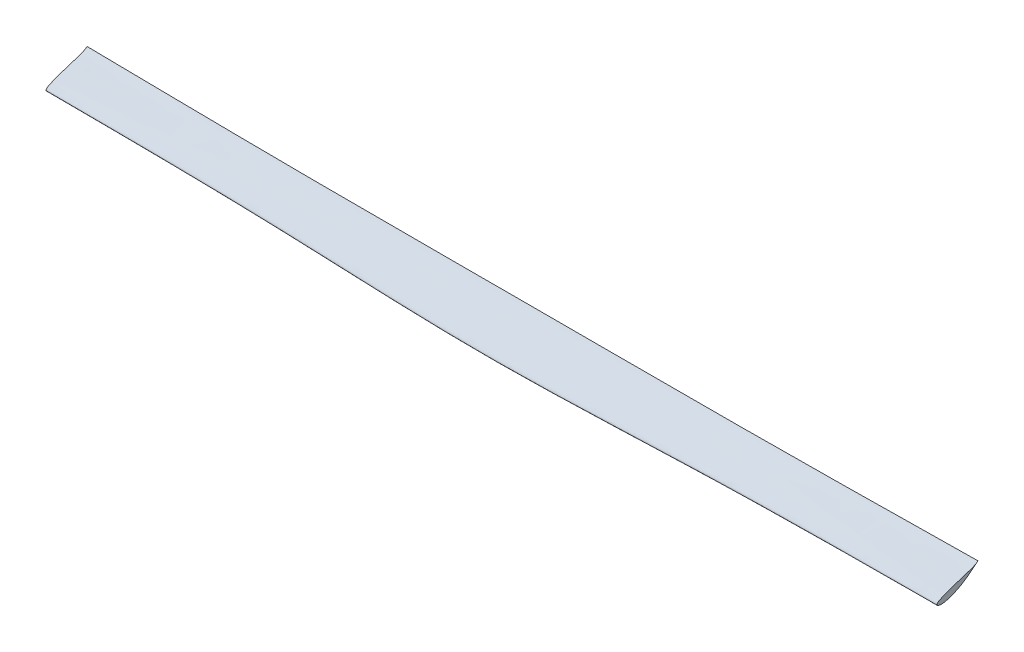
ISO-10303-21;
HEADER;
FILE_DESCRIPTION(('STEP AP214'),'2;1');
FILE_NAME('part.step','',(''),(''),'','','');
FILE_SCHEMA(('AUTOMOTIVE_DESIGN { 1 0 10303 214 1 1 1 1 }'));
ENDSEC;
DATA;
#1=APPLICATION_CONTEXT('core data for automotive mechanical design processes');
#2=APPLICATION_PROTOCOL_DEFINITION('international standard','automotive_design',2000,#1);
#3=PRODUCT_CONTEXT('',#1,'mechanical');
#4=PRODUCT('Part','Part','',(#3));
#5=PRODUCT_RELATED_PRODUCT_CATEGORY('part','',(#4));
#6=PRODUCT_DEFINITION_FORMATION('','',#4);
#7=PRODUCT_DEFINITION_CONTEXT('part definition',#1,'design');
#8=PRODUCT_DEFINITION('design','',#6,#7);
#9=PRODUCT_DEFINITION_SHAPE('','',#8);
#10=(LENGTH_UNIT() NAMED_UNIT(*) SI_UNIT(.MILLI.,.METRE.));
#11=(NAMED_UNIT(*) PLANE_ANGLE_UNIT() SI_UNIT($,.RADIAN.));
#12=(NAMED_UNIT(*) SI_UNIT($,.STERADIAN.) SOLID_ANGLE_UNIT());
#13=UNCERTAINTY_MEASURE_WITH_UNIT(LENGTH_MEASURE(1.E-05),#10,'distance_accuracy_value','');
#14=(GEOMETRIC_REPRESENTATION_CONTEXT(3) GLOBAL_UNCERTAINTY_ASSIGNED_CONTEXT((#13)) GLOBAL_UNIT_ASSIGNED_CONTEXT((#10,
#11,#12)) REPRESENTATION_CONTEXT('',''));
#15=CARTESIAN_POINT('',(0.,0.,0.));
#16=DIRECTION('',(0.,0.,1.));
#17=DIRECTION('',(1.,0.,0.));
#18=AXIS2_PLACEMENT_3D('',#15,#16,#17);
#19=CARTESIAN_POINT('',(0.,37.2225260985958,-31.6288068771115));
#20=DIRECTION('',(1.,0.,0.));
#21=DIRECTION('',(0.,0.,-1.));
#22=AXIS2_PLACEMENT_3D('',#19,#20,#21);
#23=PLANE('',#22);
#24=CARTESIAN_POINT('',(0.,19.1570127389866,5.52960942849268));
#25=CARTESIAN_POINT('',(0.,20.4247435444945,5.9606313577772));
#26=CARTESIAN_POINT('',(0.,22.0152903675708,4.89456819986246));
#27=CARTESIAN_POINT('',(0.,23.5484223501776,2.88533220088075));
#28=CARTESIAN_POINT('',(0.,24.6701336557368,1.07113278535881));
#29=CARTESIAN_POINT('',(0.,25.9759365849844,-1.40713073966001));
#30=CARTESIAN_POINT('',(0.,27.4632230783573,-4.56504239323527));
#31=CARTESIAN_POINT('',(0.,29.6419402957343,-9.70227857894741));
#32=CARTESIAN_POINT('',(0.,32.134522271651,-16.2247306412378));
#33=CARTESIAN_POINT('',(0.,34.8239215632893,-24.168186580397));
#34=CARTESIAN_POINT('',(0.,37.4145578947529,-32.1584172697215));
#35=CARTESIAN_POINT('',(0.,39.8726516665788,-40.202959107043));
#36=CARTESIAN_POINT('',(0.,42.2161297518676,-48.2816460771843));
#37=CARTESIAN_POINT('',(0.,44.6730677716377,-56.3117420185499));
#38=CARTESIAN_POINT('',(0.,47.8741969284861,-64.1236578599714));
#39=CARTESIAN_POINT('',(0.,50.8311266198712,-68.9254583444286));
#40=CARTESIAN_POINT('',(0.,52.5778443567333,-71.1533987841051));
#41=B_SPLINE_CURVE_WITH_KNOTS('',3,(#24,#25,#26,#27,#28,#29,#30,#31,#32,#33,#34,#35,#36,#37,#38,
#39,#40),.UNSPECIFIED.,.F.,.F.,(4,1,1,1,1,1,1,1,1,1,1,1,1,1,4),(0.,0.038512854671057,
0.0640037544366625,0.0888215183442964,0.113437464952506,0.162519050549693,0.211561417933988,
0.309713268740919,0.408059003030703,0.506549020337288,0.605193643191186,0.703947437022228,
0.802464557110486,0.900549733259389,1.),.UNSPECIFIED.);
#42=CARTESIAN_POINT('',(0.,52.5778443567333,-71.1533987841051));
#43=VERTEX_POINT('',#42);
#44=CARTESIAN_POINT('',(0.,19.1570127389866,5.52960942849268));
#45=VERTEX_POINT('',#44);
#46=EDGE_CURVE('E90',#43,#45,#41,.F.);
#47=ORIENTED_EDGE('',*,*,#46,.F.);
#48=CARTESIAN_POINT('',(0.,52.5778443567333,-71.1533987841051));
#49=CARTESIAN_POINT('',(0.,50.7438013139919,-68.8998678347965));
#50=CARTESIAN_POINT('',(0.,47.0131069298843,-64.46118374576));
#51=CARTESIAN_POINT('',(0.,41.5985915307445,-57.6928718865616));
#52=CARTESIAN_POINT('',(0.,36.4218583061584,-50.8226562779685));
#53=CARTESIAN_POINT('',(0.,31.6450772677143,-43.7645012400325));
#54=CARTESIAN_POINT('',(0.,27.3375257945666,-36.4960251543237));
#55=CARTESIAN_POINT('',(0.,23.6297544937018,-28.9583132251628));
#56=CARTESIAN_POINT('',(0.,20.4551565714818,-21.1930228284134));
#57=CARTESIAN_POINT('',(0.,18.3118507642729,-14.5038938461171));
#58=CARTESIAN_POINT('',(0.,17.0789133516356,-8.96315542638664));
#59=CARTESIAN_POINT('',(0.,16.5996295876524,-5.36964153516853));
#60=CARTESIAN_POINT('',(0.,16.4906527616919,-2.39629366331593));
#61=CARTESIAN_POINT('',(0.,16.5921527446577,-0.035540633008535));
#62=CARTESIAN_POINT('',(0.,17.0746938181104,2.82432844034179));
#63=CARTESIAN_POINT('',(0.,17.9500089462581,4.8117519486013));
#64=CARTESIAN_POINT('',(0.,19.1570127389866,5.52960942849268));
#65=B_SPLINE_CURVE_WITH_KNOTS('',3,(#48,#49,#50,#51,#52,#53,#54,#55,#56,#57,#58,#59,#60,#61,#62,
#63,#64),.UNSPECIFIED.,.F.,.F.,(4,1,1,1,1,1,1,1,1,1,1,1,1,1,4),(0.,0.0994663530511468,
0.198488638113877,0.296697313373103,0.39387621036719,0.490108363418491,0.58570080903983,
0.68116964714168,0.777118286663019,0.825716711706629,0.875356964297213,0.900953601760298,
0.927506802585977,0.956099032423321,1.),.UNSPECIFIED.);
#66=EDGE_CURVE('E54',#45,#43,#65,.F.);
#67=ORIENTED_EDGE('',*,*,#66,.F.);
#68=EDGE_LOOP('',(#47,#67));
#69=FACE_BOUND('',#68,.T.);
#70=ADVANCED_FACE('F51',(#69),#23,.F.);
#71=CARTESIAN_POINT('',(1667.14843894442,37.2225260985949,-31.6288068771109));
#72=DIRECTION('',(1.,0.,0.));
#73=DIRECTION('',(0.,0.,-1.));
#74=AXIS2_PLACEMENT_3D('',#71,#72,#73);
#75=PLANE('',#74);
#76=CARTESIAN_POINT('',(1667.14843894442,19.1570127389866,5.52960942849268));
#77=CARTESIAN_POINT('',(1667.14843894442,20.4247435444939,5.96063135777738));
#78=CARTESIAN_POINT('',(1667.14843894442,22.0152903675702,4.89456819986259));
#79=CARTESIAN_POINT('',(1667.14843894442,23.5484223501769,2.88533220088094));
#80=CARTESIAN_POINT('',(1667.14843894442,24.6701336557361,1.07113278535898));
#81=CARTESIAN_POINT('',(1667.14843894442,25.9759365849838,-1.40713073965979));
#82=CARTESIAN_POINT('',(1667.14843894442,27.4632230783566,-4.56504239323495));
#83=CARTESIAN_POINT('',(1667.14843894442,29.6419402957335,-9.70227857894701));
#84=CARTESIAN_POINT('',(1667.14843894442,32.1345222716501,-16.2247306412374));
#85=CARTESIAN_POINT('',(1667.14843894442,34.8239215632884,-24.1681865803964));
#86=CARTESIAN_POINT('',(1667.14843894442,37.4145578947519,-32.1584172697209));
#87=CARTESIAN_POINT('',(1667.14843894442,39.8726516665781,-40.2029591070423));
#88=CARTESIAN_POINT('',(1667.14843894442,42.2161297518667,-48.2816460771835));
#89=CARTESIAN_POINT('',(1667.14843894442,44.6730677716368,-56.311742018549));
#90=CARTESIAN_POINT('',(1667.14843894442,47.8741969284853,-64.1236578599704));
#91=CARTESIAN_POINT('',(1667.14843894442,50.8311266198701,-68.9254583444276));
#92=CARTESIAN_POINT('',(1667.14843894442,52.5778443567333,-71.1533987841051));
#93=B_SPLINE_CURVE_WITH_KNOTS('',3,(#76,#77,#78,#79,#80,#81,#82,#83,#84,#85,#86,#87,#88,#89,#90,
#91,#92),.UNSPECIFIED.,.F.,.F.,(4,1,1,1,1,1,1,1,1,1,1,1,1,1,4),(0.,0.038512854671057,
0.0640037544366625,0.0888215183442964,0.113437464952506,0.162519050549693,0.211561417933988,
0.309713268740919,0.408059003030703,0.506549020337288,0.605193643191186,0.703947437022228,
0.802464557110486,0.900549733259389,1.),.UNSPECIFIED.);
#94=CARTESIAN_POINT('',(1667.14843894442,19.1570127389866,5.52960942849268));
#95=VERTEX_POINT('',#94);
#96=CARTESIAN_POINT('',(1667.14843894442,52.5778443567333,-71.1533987841051));
#97=VERTEX_POINT('',#96);
#98=EDGE_CURVE('E76',#95,#97,#93,.T.);
#99=ORIENTED_EDGE('',*,*,#98,.F.);
#100=CARTESIAN_POINT('',(1667.14843894442,52.5778443567333,-71.1533987841051));
#101=CARTESIAN_POINT('',(1667.14843894442,50.7438013139906,-68.899867834795));
#102=CARTESIAN_POINT('',(1667.14843894442,47.013106929883,-64.4611837457584));
#103=CARTESIAN_POINT('',(1667.14843894442,41.5985915307432,-57.6928718865603));
#104=CARTESIAN_POINT('',(1667.14843894442,36.4218583061574,-50.8226562779675));
#105=CARTESIAN_POINT('',(1667.14843894442,31.6450772677133,-43.7645012400315));
#106=CARTESIAN_POINT('',(1667.14843894442,27.3375257945657,-36.4960251543228));
#107=CARTESIAN_POINT('',(1667.14843894442,23.629754493701,-28.9583132251622));
#108=CARTESIAN_POINT('',(1667.14843894442,20.4551565714809,-21.1930228284128));
#109=CARTESIAN_POINT('',(1667.14843894442,18.3118507642721,-14.5038938461166));
#110=CARTESIAN_POINT('',(1667.14843894442,17.078913351635,-8.96315542638633));
#111=CARTESIAN_POINT('',(1667.14843894442,16.5996295876517,-5.36964153516822));
#112=CARTESIAN_POINT('',(1667.14843894442,16.4906527616913,-2.39629366331569));
#113=CARTESIAN_POINT('',(1667.14843894442,16.592152744657,-0.0355406330082523));
#114=CARTESIAN_POINT('',(1667.14843894442,17.0746938181099,2.82432844034195));
#115=CARTESIAN_POINT('',(1667.14843894442,17.9500089462573,4.81175194860149));
#116=CARTESIAN_POINT('',(1667.14843894442,19.1570127389866,5.52960942849267));
#117=B_SPLINE_CURVE_WITH_KNOTS('',3,(#100,#101,#102,#103,#104,#105,#106,#107,#108,#109,#110,
#111,#112,#113,#114,#115,#116),.UNSPECIFIED.,.F.,.F.,(4,1,1,1,1,1,1,1,1,1,1,1,1,1,4),(0.,
0.0994663530511468,0.198488638113877,0.296697313373103,0.39387621036719,0.490108363418491,
0.58570080903983,0.68116964714168,0.777118286663019,0.825716711706629,0.875356964297213,
0.900953601760298,0.927506802585977,0.956099032423321,1.),.UNSPECIFIED.);
#118=EDGE_CURVE('E12',#97,#95,#117,.T.);
#119=ORIENTED_EDGE('',*,*,#118,.F.);
#120=EDGE_LOOP('',(#99,#119));
#121=FACE_BOUND('',#120,.T.);
#122=ADVANCED_FACE('F77',(#121),#75,.T.);
#123=CARTESIAN_POINT('',(1667.14843894442,52.5778443567333,-71.1533987841051));
#124=CARTESIAN_POINT('',(1528.2303052152,52.0692074538892,-69.6819747978246));
#125=CARTESIAN_POINT('',(1250.35225009495,51.05178064624,-66.7386842094129));
#126=CARTESIAN_POINT('',(833.574219472282,62.3857654807093,-56.7174491274794));
#127=CARTESIAN_POINT('',(416.796188849479,51.05178064624,-66.7386842094129));
#128=CARTESIAN_POINT('',(138.918133729224,52.0692074538892,-69.6819747978245));
#129=CARTESIAN_POINT('',(0.,52.5778443567333,-71.1533987841051));
#130=CARTESIAN_POINT('',(1667.14843894442,50.7438013139906,-68.899867834795));
#131=CARTESIAN_POINT('',(1528.22959748317,50.1508158554429,-67.5592085055839));
#132=CARTESIAN_POINT('',(1250.35012668598,48.9646665636807,-64.8774865663432));
#133=CARTESIAN_POINT('',(833.57421947228,60.0452247883496,-54.2776113906682));
#134=CARTESIAN_POINT('',(416.798312258446,48.9646665636814,-64.877486566344));
#135=CARTESIAN_POINT('',(138.91884146125,50.150815855444,-67.5592085055851));
#136=CARTESIAN_POINT('',(0.,50.7438013139919,-68.8998678347965));
#137=CARTESIAN_POINT('',(1667.14843894442,47.013106929883,-64.4611837457584));
#138=CARTESIAN_POINT('',(1528.2281851788,46.2518009344408,-63.3814699312758));
#139=CARTESIAN_POINT('',(1250.34588934801,44.7289599367548,-61.2217175159454));
#140=CARTESIAN_POINT('',(833.574219472275,55.3037963660817,-49.4671454941333));
#141=CARTESIAN_POINT('',(416.802549596412,44.7289599367555,-61.2217175159462));
#142=CARTESIAN_POINT('',(138.920253765628,46.2518009344419,-63.3814699312771));
#143=CARTESIAN_POINT('',(0.,47.0131069298843,-64.46118374576));
#144=CARTESIAN_POINT('',(1667.14843894442,41.5985915307432,-57.6928718865603));
#145=CARTESIAN_POINT('',(1528.22607409114,40.5856829672311,-57.0032148223906));
#146=CARTESIAN_POINT('',(1250.33955545,38.5595611493841,-55.623693239809));
#147=CARTESIAN_POINT('',(833.574219472268,48.3784535638897,-42.143100750202));
#148=CARTESIAN_POINT('',(416.808883494424,38.5595611493847,-55.6236932398097));
#149=CARTESIAN_POINT('',(138.922364853288,40.5856829672322,-57.0032148223917));
#150=CARTESIAN_POINT('',(0.,41.5985915307445,-57.6928718865616));
#151=CARTESIAN_POINT('',(1667.14843894442,36.4218583061574,-50.8226562779675));
#152=CARTESIAN_POINT('',(1528.22397927939,35.1592869623403,-50.5200487320399));
#153=CARTESIAN_POINT('',(1250.33327038463,32.6337644833648,-49.9147426134666));
#154=CARTESIAN_POINT('',(833.574219472261,41.7025410069908,-34.7214368071432));
#155=CARTESIAN_POINT('',(416.815168559795,32.6337644833653,-49.914742613467));
#156=CARTESIAN_POINT('',(138.924459665033,35.1592869623411,-50.5200487320407));
#157=CARTESIAN_POINT('',(0.,36.4218583061584,-50.8226562779685));
#158=CARTESIAN_POINT('',(1667.14843894442,31.6450772677133,-43.7645012400315));
#159=CARTESIAN_POINT('',(1528.22190432025,30.1352092060652,-43.8452751311863));
#160=CARTESIAN_POINT('',(1250.32704488303,27.1150189026396,-44.0068472109143));
#161=CARTESIAN_POINT('',(833.574219472255,35.4407884086368,-27.1170595289512));
#162=CARTESIAN_POINT('',(416.821394061392,27.1150189026401,-44.0068472109147));
#163=CARTESIAN_POINT('',(138.926534624177,30.135209206066,-43.845275131187));
#164=CARTESIAN_POINT('',(0.,31.6450772677143,-43.7645012400325));
#165=CARTESIAN_POINT('',(1667.14843894442,27.3375257945657,-36.4960251543228));
#166=CARTESIAN_POINT('',(1528.21984797634,25.5825796064451,-36.9567410242816));
#167=CARTESIAN_POINT('',(1250.32087523274,22.0721593286562,-37.8783113511385));
#168=CARTESIAN_POINT('',(833.574219472248,29.661587610906,-19.3072615670217));
#169=CARTESIAN_POINT('',(416.827563711686,22.0721593286566,-37.8783113511389));
#170=CARTESIAN_POINT('',(138.928590968087,25.5825796064458,-36.9567410242824));
#171=CARTESIAN_POINT('',(0.,27.3375257945666,-36.4960251543237));
#172=CARTESIAN_POINT('',(1667.14843894442,23.629754493701,-28.9583132251622));
#173=CARTESIAN_POINT('',(1528.21780379999,21.6311803277592,-29.7967229240959));
#174=CARTESIAN_POINT('',(1250.3147420888,17.6334308091256,-31.4737945221624));
#175=CARTESIAN_POINT('',(833.574219472241,24.4908748628765,-11.2314308103986));
#176=CARTESIAN_POINT('',(416.833696855621,17.633430809126,-31.4737945221627));
#177=CARTESIAN_POINT('',(138.93063514443,21.6311803277599,-29.7967229240965));
#178=CARTESIAN_POINT('',(0.,23.6297544937018,-28.9583132251628));
#179=CARTESIAN_POINT('',(1667.14843894442,20.4551565714809,-21.1930228284128));
#180=CARTESIAN_POINT('',(1528.21576164093,18.2131948502935,-22.4087536317933));
#181=CARTESIAN_POINT('',(1250.30861499732,13.7285970082873,-24.8405809398943));
#182=CARTESIAN_POINT('',(833.574219472235,19.8547791870843,-2.92855262500909));
#183=CARTESIAN_POINT('',(416.839823947105,13.7285970082876,-24.8405809398946));
#184=CARTESIAN_POINT('',(138.932677303493,18.2131948502942,-22.4087536317938));
#185=CARTESIAN_POINT('',(0.,20.4551565714818,-21.1930228284134));
#186=CARTESIAN_POINT('',(1667.14843894442,18.3118507642721,-14.5038938461166));
#187=CARTESIAN_POINT('',(1528.21405385799,15.8663529314765,-16.0351644902637));
#188=CARTESIAN_POINT('',(1250.30349113478,10.9746216409986,-19.0981663967514));
#189=CARTESIAN_POINT('',(833.574219472229,16.4892762565018,4.21014136498605));
#190=CARTESIAN_POINT('',(416.844947809642,10.974621640999,-19.0981663967517));
#191=CARTESIAN_POINT('',(138.934385086433,15.8663529314772,-16.0351644902641));
#192=CARTESIAN_POINT('',(0.,18.3118507642729,-14.5038938461171));
#193=CARTESIAN_POINT('',(1667.14843894442,17.078913351635,-8.96315542638633));
#194=CARTESIAN_POINT('',(1528.21267215876,14.4687425491806,-10.7497168010781));
#195=CARTESIAN_POINT('',(1250.29934562147,9.24761578446729,-14.3233769621048));
#196=CARTESIAN_POINT('',(833.574219472225,14.2675077798138,10.1146049452665));
#197=CARTESIAN_POINT('',(416.849093322953,9.24761578446762,-14.323376962105));
#198=CARTESIAN_POINT('',(138.935766785662,14.4687425491812,-10.7497168010783));
#199=CARTESIAN_POINT('',(0.,17.0789133516356,-8.96315542638664));
#200=CARTESIAN_POINT('',(1667.14843894442,16.5996295876517,-5.36964153516822));
#201=CARTESIAN_POINT('',(1528.21179103449,13.8844450830442,-7.31900452080708));
#202=CARTESIAN_POINT('',(1250.29670198359,8.45325932508112,-11.2183168757267));
#203=CARTESIAN_POINT('',(833.574219472222,13.1576359414475,13.9400702353984));
#204=CARTESIAN_POINT('',(416.851736960832,8.45325932508147,-11.2183168757269));
#205=CARTESIAN_POINT('',(138.936647909938,13.8844450830448,-7.31900452080734));
#206=CARTESIAN_POINT('',(0.,16.5996295876524,-5.36964153516853));
#207=CARTESIAN_POINT('',(1667.14843894442,16.4906527616913,-2.39629366331569));
#208=CARTESIAN_POINT('',(1528.21106676839,13.6891491462764,-4.47947623636862));
#209=CARTESIAN_POINT('',(1250.29452896744,8.08529920123451,-8.64646802009555));
#210=CARTESIAN_POINT('',(833.574219472219,12.5303286428875,17.1040774030784));
#211=CARTESIAN_POINT('',(416.853909976984,8.08529920123483,-8.64646802009567));
#212=CARTESIAN_POINT('',(138.937372176034,13.689149146277,-4.47947623636882));
#213=CARTESIAN_POINT('',(0.,16.4906527616919,-2.39629366331593));
#214=CARTESIAN_POINT('',(1667.14843894442,16.592152744657,-0.0355406330082523));
#215=CARTESIAN_POINT('',(1528.2104922651,13.7221789720276,-2.22487175303912));
#216=CARTESIAN_POINT('',(1250.29280528474,7.98136811619739,-6.60419256103558));
#217=CARTESIAN_POINT('',(833.574219472218,12.220677854998,19.6160654477137));
#218=CARTESIAN_POINT('',(416.855633659679,7.98136811619776,-6.60419256103572));
#219=CARTESIAN_POINT('',(138.937946679328,13.7221789720282,-2.22487175303936));
#220=CARTESIAN_POINT('',(0.,16.5921527446577,-0.035540633008535));
#221=CARTESIAN_POINT('',(1667.14843894442,17.0746938181099,2.82432844034195));
#222=CARTESIAN_POINT('',(1528.20978752117,14.1207276160517,0.504784761968877));
#223=CARTESIAN_POINT('',(1250.29069084098,8.21190663578407,-4.13500033166861));
#224=CARTESIAN_POINT('',(833.574219472215,12.1988597519794,22.6614547065702));
#225=CARTESIAN_POINT('',(416.857748103446,8.21190663578436,-4.13500033166869));
#226=CARTESIAN_POINT('',(138.938651423252,14.1207276160522,0.504784761968733));
#227=CARTESIAN_POINT('',(0.,17.0746938181104,2.82432844034179));
#228=CARTESIAN_POINT('',(1667.14843894442,17.9500089462573,4.81175194860149));
#229=CARTESIAN_POINT('',(1528.20927171099,14.934567719604,2.39690420197907));
#230=CARTESIAN_POINT('',(1250.28914325528,8.90277819797731,-2.43351769636667));
#231=CARTESIAN_POINT('',(833.574219472214,12.7050286012382,24.7846625711638));
#232=CARTESIAN_POINT('',(416.859295689144,8.90277819797769,-2.43351769636677));
#233=CARTESIAN_POINT('',(138.939167233432,14.9345677196046,2.39690420197891));
#234=CARTESIAN_POINT('',(0.,17.9500089462581,4.8117519486013));
#235=CARTESIAN_POINT('',(1667.14843894442,19.1570127389866,5.52960942849267));
#236=CARTESIAN_POINT('',(1528.20895934284,16.1043430114834,3.05704673813225));
#237=CARTESIAN_POINT('',(1250.28820605687,9.99808528953264,-1.88882240879627));
#238=CARTESIAN_POINT('',(833.574219472213,13.6884820554713,25.5847493475613));
#239=CARTESIAN_POINT('',(416.860232887557,9.99808528953265,-1.88882240879627));
#240=CARTESIAN_POINT('',(138.939479601582,16.1043430114834,3.05704673813225));
#241=CARTESIAN_POINT('',(0.,19.1570127389866,5.52960942849268));
#242=B_SPLINE_SURFACE_WITH_KNOTS('',3,3,((#123,#124,#125,#126,#127,#128,#129),(#130,#131,#132,
#133,#134,#135,#136),(#137,#138,#139,#140,#141,#142,#143),(#144,#145,#146,#147,#148,#149,#150),
(#151,#152,#153,#154,#155,#156,#157),(#158,#159,#160,#161,#162,#163,#164),(#165,#166,#167,#168,
#169,#170,#171),(#172,#173,#174,#175,#176,#177,#178),(#179,#180,#181,#182,#183,#184,#185),(#186,
#187,#188,#189,#190,#191,#192),(#193,#194,#195,#196,#197,#198,#199),(#200,#201,#202,#203,#204,
#205,#206),(#207,#208,#209,#210,#211,#212,#213),(#214,#215,#216,#217,#218,#219,#220),(#221,#222,
#223,#224,#225,#226,#227),(#228,#229,#230,#231,#232,#233,#234),(#235,#236,#237,#238,#239,#240,
#241)),.UNSPECIFIED.,.F.,.F.,.F.,(4,1,1,1,1,1,1,1,1,1,1,1,1,1,4),(4,1,1,1,4),(0.,
0.0994663530511468,0.198488638113877,0.296697313373103,0.39387621036719,0.490108363418491,
0.58570080903983,0.68116964714168,0.777118286663019,0.825716711706629,0.875356964297213,
0.900953601760298,0.927506802585977,0.956099032423321,1.),(0.,0.249962404676228,0.5,
0.750037595323772,1.),.UNSPECIFIED.);
#243=CARTESIAN_POINT('',(1667.14843894442,19.1570127389866,5.52960942849268));
#244=CARTESIAN_POINT('',(1528.20895934284,16.1043430114834,3.05704673813225));
#245=CARTESIAN_POINT('',(1250.28820605687,9.99808528953264,-1.88882240879627));
#246=CARTESIAN_POINT('',(833.574219472213,13.6884820554713,25.5847493475613));
#247=CARTESIAN_POINT('',(416.860232887557,9.99808528953264,-1.88882240879627));
#248=CARTESIAN_POINT('',(138.939479601582,16.1043430114834,3.05704673813225));
#249=CARTESIAN_POINT('',(0.,19.1570127389866,5.52960942849268));
#250=B_SPLINE_CURVE_WITH_KNOTS('',3,(#243,#244,#245,#246,#247,#248,#249),.UNSPECIFIED.,.F.,.F.,
(4,1,1,1,4),(0.,0.249962404676228,0.5,0.750037595323772,1.),.UNSPECIFIED.);
#251=EDGE_CURVE('E88',#45,#95,#250,.F.);
#252=CARTESIAN_POINT('',(1667.14843894442,52.5778443567333,-71.1533987841051));
#253=CARTESIAN_POINT('',(1528.2303052152,52.0692074538892,-69.6819747978246));
#254=CARTESIAN_POINT('',(1250.35225009495,51.05178064624,-66.7386842094129));
#255=CARTESIAN_POINT('',(833.574219472282,62.3857654807093,-56.7174491274794));
#256=CARTESIAN_POINT('',(416.796188849479,51.05178064624,-66.7386842094129));
#257=CARTESIAN_POINT('',(138.918133729224,52.0692074538892,-69.6819747978245));
#258=CARTESIAN_POINT('',(0.,52.5778443567333,-71.1533987841051));
#259=B_SPLINE_CURVE_WITH_KNOTS('',3,(#252,#253,#254,#255,#256,#257,#258),.UNSPECIFIED.,.F.,.F.,
(4,1,1,1,4),(0.,0.249962404676228,0.5,0.750037595323772,1.),.UNSPECIFIED.);
#260=EDGE_CURVE('E83',#97,#43,#259,.T.);
#261=ORIENTED_EDGE('',*,*,#118,.T.);
#262=ORIENTED_EDGE('',*,*,#251,.F.);
#263=ORIENTED_EDGE('',*,*,#66,.T.);
#264=ORIENTED_EDGE('',*,*,#260,.F.);
#265=EDGE_LOOP('',(#261,#262,#263,#264));
#266=FACE_BOUND('',#265,.T.);
#267=ADVANCED_FACE('F87',(#266),#242,.T.);
#268=CARTESIAN_POINT('',(1667.14843894442,19.1570127389866,5.52960942849268));
#269=CARTESIAN_POINT('',(1528.20895934284,16.1043430114834,3.05704673813225));
#270=CARTESIAN_POINT('',(1250.28820605687,9.99808528953264,-1.88882240879627));
#271=CARTESIAN_POINT('',(833.574219472213,13.6884820554713,25.5847493475613));
#272=CARTESIAN_POINT('',(416.860232887557,9.99808528953264,-1.88882240879627));
#273=CARTESIAN_POINT('',(138.939479601582,16.1043430114834,3.05704673813225));
#274=CARTESIAN_POINT('',(0.,19.1570127389866,5.52960942849268));
#275=CARTESIAN_POINT('',(1667.14843894442,20.4247435444939,5.96063135777738));
#276=CARTESIAN_POINT('',(1528.209233373,17.4047331391423,3.53870006265095));
#277=CARTESIAN_POINT('',(1250.28902822978,11.3638038856743,-1.30589106348963));
#278=CARTESIAN_POINT('',(833.574219472213,15.152326117096,25.9436342575304));
#279=CARTESIAN_POINT('',(416.859410714647,11.3638038856746,-1.30589106348971));
#280=CARTESIAN_POINT('',(138.939205571422,17.4047331391428,3.5387000626508));
#281=CARTESIAN_POINT('',(0.,20.4247435444945,5.9606313577772));
#282=CARTESIAN_POINT('',(1667.14843894442,22.0152903675702,4.89456819986259));
#283=CARTESIAN_POINT('',(1528.20968877833,19.0495558462813,2.55678022298724));
#284=CARTESIAN_POINT('',(1250.29039458274,13.1171946875495,-2.11949895568256));
#285=CARTESIAN_POINT('',(833.574219472215,17.068789696889,24.7576880083856));
#286=CARTESIAN_POINT('',(416.858044361685,13.1171946875499,-2.11949895568263));
#287=CARTESIAN_POINT('',(138.938750166098,19.0495558462819,2.55678022298712));
#288=CARTESIAN_POINT('',(0.,22.0152903675708,4.89456819986246));
#289=CARTESIAN_POINT('',(1667.14843894442,23.5484223501769,2.88533220088094));
#290=CARTESIAN_POINT('',(1528.21032076926,20.6580094482893,0.664314518988556));
#291=CARTESIAN_POINT('',(1250.29229074564,14.8763141856928,-3.77838894429672));
#292=CARTESIAN_POINT('',(833.574219472217,19.0542142276473,22.582083672412));
#293=CARTESIAN_POINT('',(416.856148198784,14.8763141856931,-3.77838894429681));
#294=CARTESIAN_POINT('',(138.938118175167,20.6580094482899,0.6643145189884));
#295=CARTESIAN_POINT('',(0.,23.5484223501776,2.88533220088075));
#296=CARTESIAN_POINT('',(1667.14843894442,24.6701336557361,1.07113278535898));
#297=CARTESIAN_POINT('',(1528.21085387965,21.8432576431588,-1.05138434163255));
#298=CARTESIAN_POINT('',(1250.29389023717,16.1886552715763,-5.29705706537834));
#299=CARTESIAN_POINT('',(833.574219472219,20.5574529325931,20.6275457100531));
#300=CARTESIAN_POINT('',(416.854548707253,16.1886552715767,-5.29705706537842));
#301=CARTESIAN_POINT('',(138.937585064778,21.8432576431594,-1.05138434163269));
#302=CARTESIAN_POINT('',(0.,24.6701336557368,1.07113278535881));
#303=CARTESIAN_POINT('',(1667.14843894442,25.9759365849838,-1.40713073965979));
#304=CARTESIAN_POINT('',(1528.21155484462,23.2326026214207,-3.40013352821295));
#305=CARTESIAN_POINT('',(1250.29599334296,17.7451094779687,-7.3867386161554));
#306=CARTESIAN_POINT('',(833.574219472221,22.3649105862979,17.9647567874943));
#307=CARTESIAN_POINT('',(416.852445601461,17.7451094779691,-7.38673861615551));
#308=CARTESIAN_POINT('',(138.936884099799,23.2326026214212,-3.40013352821313));
#309=CARTESIAN_POINT('',(0.,25.9759365849844,-1.40713073966001));
#310=CARTESIAN_POINT('',(1667.14843894442,27.4632230783566,-4.56504239323495));
#311=CARTESIAN_POINT('',(1528.2124281747,24.8239738926106,-6.39668367223012));
#312=CARTESIAN_POINT('',(1250.2986135959,19.5446816143088,-10.0605172022517));
#313=CARTESIAN_POINT('',(833.574219472224,24.4772071333168,14.5769455177232));
#314=CARTESIAN_POINT('',(416.849825348526,19.5446816143092,-10.0605172022518));
#315=CARTESIAN_POINT('',(138.936010769722,24.8239738926112,-6.39668367223038));
#316=CARTESIAN_POINT('',(0.,27.4632230783573,-4.56504239323527));
#317=CARTESIAN_POINT('',(1667.14843894442,29.6419402957335,-9.70227857894701));
#318=CARTESIAN_POINT('',(1528.21382473412,27.1691351391623,-11.2758834729127));
#319=CARTESIAN_POINT('',(1250.30280369425,22.2227809868764,-14.4235666135113));
#320=CARTESIAN_POINT('',(833.574219472228,27.6553903032106,9.07207230354409));
#321=CARTESIAN_POINT('',(416.845635250176,22.2227809868768,-14.4235666135114));
#322=CARTESIAN_POINT('',(138.934614210304,27.169135139163,-11.275883472913));
#323=CARTESIAN_POINT('',(0.,29.6419402957343,-9.70227857894741));
#324=CARTESIAN_POINT('',(1667.14843894442,32.1345222716501,-16.2247306412374));
#325=CARTESIAN_POINT('',(1528.21557182228,29.8699376813712,-17.4755334348137));
#326=CARTESIAN_POINT('',(1250.30804548427,25.3400872960459,-19.9775152732354));
#327=CARTESIAN_POINT('',(833.574219472234,31.3982986960905,2.08970833791302));
#328=CARTESIAN_POINT('',(416.840393460154,25.3400872960463,-19.9775152732356));
#329=CARTESIAN_POINT('',(138.932867122143,29.8699376813719,-17.4755334348141));
#330=CARTESIAN_POINT('',(0.,32.134522271651,-16.2247306412378));
#331=CARTESIAN_POINT('',(1667.14843894442,34.8239215632884,-24.1681865803964));
#332=CARTESIAN_POINT('',(1528.21767074485,32.80948968747,-25.0311803160884));
#333=CARTESIAN_POINT('',(1250.31434288335,28.7800199789599,-26.757427382742));
#334=CARTESIAN_POINT('',(833.574219472241,35.589819285036,-6.40627808890139));
#335=CARTESIAN_POINT('',(416.834096061073,28.7800199789603,-26.7574273827422));
#336=CARTESIAN_POINT('',(138.930768199573,32.8094896874708,-25.0311803160889));
#337=CARTESIAN_POINT('',(0.,34.8239215632893,-24.168186580397));
#338=CARTESIAN_POINT('',(1667.14843894442,37.4145578947519,-32.1584172697209));
#339=CARTESIAN_POINT('',(1528.21977317364,35.6506966094815,-32.6329541187327));
#340=CARTESIAN_POINT('',(1250.32065080213,32.1224434556621,-33.5821705611541));
#341=CARTESIAN_POINT('',(833.574219472248,39.6850861832825,-14.9499622591772));
#342=CARTESIAN_POINT('',(416.827788142289,32.1224434556625,-33.5821705611544));
#343=CARTESIAN_POINT('',(138.928665770788,35.6506966094823,-32.6329541187331));
#344=CARTESIAN_POINT('',(0.,37.4145578947529,-32.1584172697215));
#345=CARTESIAN_POINT('',(1667.14843894442,39.8726516665781,-40.2029591070423));
#346=CARTESIAN_POINT('',(1528.22187850588,38.3597070108115,-40.2885026089092));
#347=CARTESIAN_POINT('',(1250.32696743218,35.3333625936854,-40.4596153447977));
#348=CARTESIAN_POINT('',(833.574219472255,43.6498884225304,-23.5487218988502));
#349=CARTESIAN_POINT('',(416.821471512244,35.3333625936858,-40.459615344798));
#350=CARTESIAN_POINT('',(138.926560438539,38.3597070108121,-40.2885026089097));
#351=CARTESIAN_POINT('',(0.,39.8726516665788,-40.202959107043));
#352=CARTESIAN_POINT('',(1667.14843894442,42.2161297518667,-48.2816460771835));
#353=CARTESIAN_POINT('',(1528.22398403098,40.9541247090593,-47.9781606009022));
#354=CARTESIAN_POINT('',(1250.33328464081,38.4297350024512,-47.3710983575332));
#355=CARTESIAN_POINT('',(833.574219472261,47.500212986687,-32.181677436572));
#356=CARTESIAN_POINT('',(416.815154303609,38.4297350024516,-47.3710983575336));
#357=CARTESIAN_POINT('',(138.924454913447,40.95412470906,-47.9781606009029));
#358=CARTESIAN_POINT('',(0.,42.2161297518676,-48.2816460771843));
#359=CARTESIAN_POINT('',(1667.14843894442,44.6730677716368,-56.311742018549));
#360=CARTESIAN_POINT('',(1528.22608557544,43.6615279248616,-55.6199630475698));
#361=CARTESIAN_POINT('',(1250.33958990637,41.6381439522088,-54.236197013083));
#362=CARTESIAN_POINT('',(833.574219472268,51.461148698449,-40.7649940663591));
#363=CARTESIAN_POINT('',(416.80884903805,41.6381439522093,-54.2361970130834));
#364=CARTESIAN_POINT('',(138.922353368981,43.6615279248623,-55.6199630475706));
#365=CARTESIAN_POINT('',(0.,44.6730677716377,-56.3117420185499));
#366=CARTESIAN_POINT('',(1667.14843894442,47.8741969284853,-64.1236578599704));
#367=CARTESIAN_POINT('',(1528.22819207552,47.11371289439,-63.0426697676679));
#368=CARTESIAN_POINT('',(1250.34591004025,45.5925160666505,-60.880368413385));
#369=CARTESIAN_POINT('',(833.574219472275,56.1698220922356,-49.1314351341325));
#370=CARTESIAN_POINT('',(416.802528904177,45.5925160666509,-60.8803684133855));
#371=CARTESIAN_POINT('',(138.920246868908,47.1137128943907,-63.0426697676688));
#372=CARTESIAN_POINT('',(0.,47.8741969284861,-64.1236578599714));
#373=CARTESIAN_POINT('',(1667.14843894442,50.8311266198701,-68.9254583444276));
#374=CARTESIAN_POINT('',(1528.22959759763,50.2381548026897,-67.5847778671516));
#375=CARTESIAN_POINT('',(1250.35012702939,49.0520327977656,-64.9030136254198));
#376=CARTESIAN_POINT('',(833.57421947228,60.1326320081449,-54.3032320309804));
#377=CARTESIAN_POINT('',(416.798311915035,49.0520327977662,-64.9030136254203));
#378=CARTESIAN_POINT('',(138.918841346791,50.2381548026906,-67.5847778671524));
#379=CARTESIAN_POINT('',(0.,50.8311266198712,-68.9254583444286));
#380=CARTESIAN_POINT('',(1667.14843894442,52.5778443567333,-71.1533987841051));
#381=CARTESIAN_POINT('',(1528.2303052152,52.0692074538892,-69.6819747978246));
#382=CARTESIAN_POINT('',(1250.35225009495,51.05178064624,-66.7386842094129));
#383=CARTESIAN_POINT('',(833.574219472282,62.3857654807093,-56.7174491274794));
#384=CARTESIAN_POINT('',(416.796188849479,51.05178064624,-66.7386842094129));
#385=CARTESIAN_POINT('',(138.918133729224,52.0692074538892,-69.6819747978245));
#386=CARTESIAN_POINT('',(0.,52.5778443567333,-71.1533987841051));
#387=B_SPLINE_SURFACE_WITH_KNOTS('',3,3,((#268,#269,#270,#271,#272,#273,#274),(#275,#276,#277,
#278,#279,#280,#281),(#282,#283,#284,#285,#286,#287,#288),(#289,#290,#291,#292,#293,#294,#295),
(#296,#297,#298,#299,#300,#301,#302),(#303,#304,#305,#306,#307,#308,#309),(#310,#311,#312,#313,
#314,#315,#316),(#317,#318,#319,#320,#321,#322,#323),(#324,#325,#326,#327,#328,#329,#330),(#331,
#332,#333,#334,#335,#336,#337),(#338,#339,#340,#341,#342,#343,#344),(#345,#346,#347,#348,#349,
#350,#351),(#352,#353,#354,#355,#356,#357,#358),(#359,#360,#361,#362,#363,#364,#365),(#366,#367,
#368,#369,#370,#371,#372),(#373,#374,#375,#376,#377,#378,#379),(#380,#381,#382,#383,#384,#385,
#386)),.UNSPECIFIED.,.F.,.F.,.F.,(4,1,1,1,1,1,1,1,1,1,1,1,1,1,4),(4,1,1,1,4),(0.,
0.038512854671057,0.0640037544366625,0.0888215183442964,0.113437464952506,0.162519050549693,
0.211561417933988,0.309713268740919,0.408059003030703,0.506549020337288,0.605193643191186,
0.703947437022228,0.802464557110486,0.900549733259389,1.),(0.,0.249962404676228,0.5,
0.750037595323772,1.),.UNSPECIFIED.);
#388=ORIENTED_EDGE('',*,*,#98,.T.);
#389=ORIENTED_EDGE('',*,*,#260,.T.);
#390=ORIENTED_EDGE('',*,*,#46,.T.);
#391=ORIENTED_EDGE('',*,*,#251,.T.);
#392=EDGE_LOOP('',(#388,#389,#390,#391));
#393=FACE_BOUND('',#392,.T.);
#394=ADVANCED_FACE('F89',(#393),#387,.T.);
#395=CLOSED_SHELL('',(#70,#122,#267,#394));
#396=MANIFOLD_SOLID_BREP('B2',#395);
#397=ADVANCED_BREP_SHAPE_REPRESENTATION('',(#18,#396),#14);
#398=SHAPE_DEFINITION_REPRESENTATION(#9,#397);
ENDSEC;
END-ISO-10303-21;
